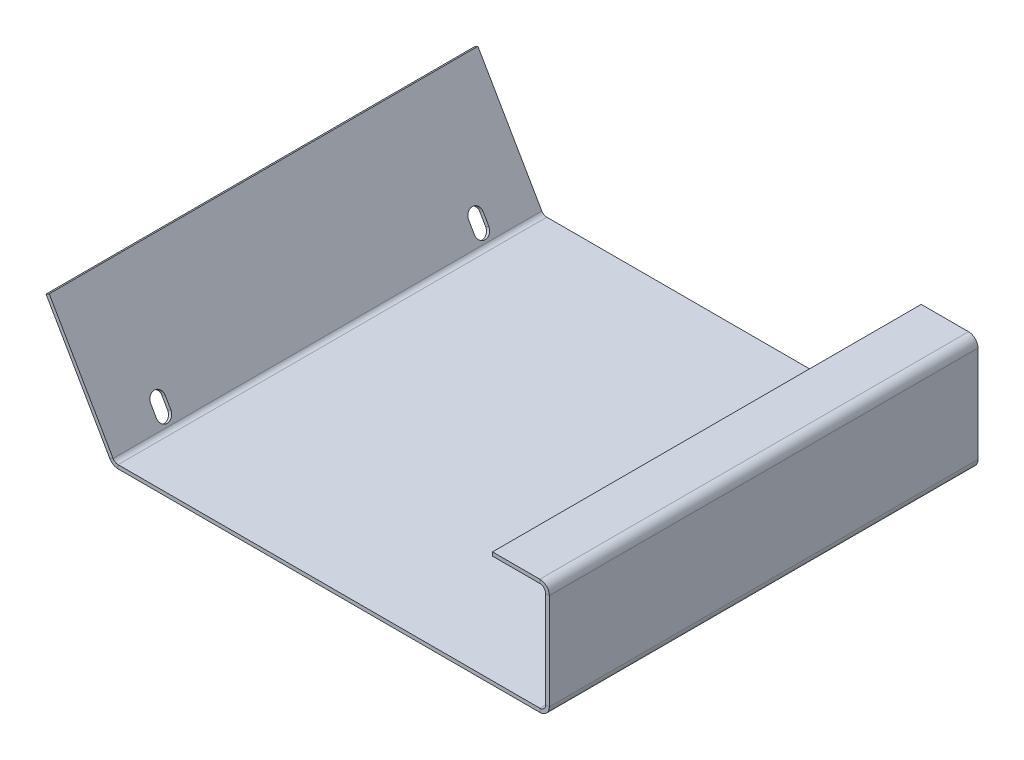
ISO-10303-21;
HEADER;
FILE_DESCRIPTION(('STEP AP214'),'2;1');
FILE_NAME('part.step','',(''),(''),'','','');
FILE_SCHEMA(('AUTOMOTIVE_DESIGN { 1 0 10303 214 1 1 1 1 }'));
ENDSEC;
DATA;
#1=APPLICATION_CONTEXT('core data for automotive mechanical design processes');
#2=APPLICATION_PROTOCOL_DEFINITION('international standard','automotive_design',2000,#1);
#3=PRODUCT_CONTEXT('',#1,'mechanical');
#4=PRODUCT('Part','Part','',(#3));
#5=PRODUCT_RELATED_PRODUCT_CATEGORY('part','',(#4));
#6=PRODUCT_DEFINITION_FORMATION('','',#4);
#7=PRODUCT_DEFINITION_CONTEXT('part definition',#1,'design');
#8=PRODUCT_DEFINITION('design','',#6,#7);
#9=PRODUCT_DEFINITION_SHAPE('','',#8);
#10=(LENGTH_UNIT() NAMED_UNIT(*) SI_UNIT(.MILLI.,.METRE.));
#11=(NAMED_UNIT(*) PLANE_ANGLE_UNIT() SI_UNIT($,.RADIAN.));
#12=(NAMED_UNIT(*) SI_UNIT($,.STERADIAN.) SOLID_ANGLE_UNIT());
#13=UNCERTAINTY_MEASURE_WITH_UNIT(LENGTH_MEASURE(1.E-05),#10,'distance_accuracy_value','');
#14=(GEOMETRIC_REPRESENTATION_CONTEXT(3) GLOBAL_UNCERTAINTY_ASSIGNED_CONTEXT((#13)) GLOBAL_UNIT_ASSIGNED_CONTEXT((#10,
#11,#12)) REPRESENTATION_CONTEXT('',''));
#15=CARTESIAN_POINT('',(0.,0.,0.));
#16=DIRECTION('',(0.,0.,1.));
#17=DIRECTION('',(1.,0.,0.));
#18=AXIS2_PLACEMENT_3D('',#15,#16,#17);
#19=CARTESIAN_POINT('',(-333.823111465835,2.08279999999999,94.375));
#20=DIRECTION('',(0.,0.,1.));
#21=DIRECTION('',(1.,0.,0.));
#22=AXIS2_PLACEMENT_3D('',#19,#20,#21);
#23=PLANE('',#22);
#24=DIRECTION('',(0.866025403784434,0.500000000000008,0.));
#25=VECTOR('',#24,1.);
#26=CARTESIAN_POINT('',(-333.823111465835,2.08279999999999,94.375));
#27=LINE('',#26,#25);
#28=CARTESIAN_POINT('',(-333.823111465835,2.08279999999999,94.375));
#29=VERTEX_POINT('',#28);
#30=CARTESIAN_POINT('',(-332.415300569443,2.8956,94.375));
#31=VERTEX_POINT('',#30);
#32=EDGE_CURVE('E11',#29,#31,#27,.T.);
#33=ORIENTED_EDGE('',*,*,#32,.F.);
#34=CARTESIAN_POINT('',(-330.21559604383,4.1656,94.375));
#35=DIRECTION('',(0.,0.,-1.));
#36=DIRECTION('',(-1.,0.,0.));
#37=AXIS2_PLACEMENT_3D('',#34,#35,#36);
#38=CIRCLE('',#37,4.1656);
#39=CARTESIAN_POINT('',(-330.21559604383,0.,94.375));
#40=VERTEX_POINT('',#39);
#41=EDGE_CURVE('E304',#40,#29,#38,.T.);
#42=ORIENTED_EDGE('',*,*,#41,.F.);
#43=DIRECTION('',(0.,-1.,0.));
#44=VECTOR('',#43,1.);
#45=CARTESIAN_POINT('',(-330.21559604383,1.6256,94.375));
#46=LINE('',#45,#44);
#47=CARTESIAN_POINT('',(-330.21559604383,1.6256,94.375));
#48=VERTEX_POINT('',#47);
#49=EDGE_CURVE('E58',#48,#40,#46,.T.);
#50=ORIENTED_EDGE('',*,*,#49,.F.);
#51=CARTESIAN_POINT('',(-330.21559604383,4.1656,94.375));
#52=DIRECTION('',(0.,0.,1.));
#53=DIRECTION('',(1.,0.,0.));
#54=AXIS2_PLACEMENT_3D('',#51,#52,#53);
#55=CIRCLE('',#54,2.54);
#56=EDGE_CURVE('E347',#48,#31,#55,.F.);
#57=ORIENTED_EDGE('',*,*,#56,.T.);
#58=EDGE_LOOP('',(#33,#42,#50,#57));
#59=FACE_BOUND('',#58,.T.);
#60=ADVANCED_FACE('F51',(#59),#23,.T.);
#61=CARTESIAN_POINT('',(-330.21559604383,1.6256,94.375));
#62=DIRECTION('',(0.,0.,1.));
#63=DIRECTION('',(1.,0.,0.));
#64=AXIS2_PLACEMENT_3D('',#61,#62,#63);
#65=PLANE('',#64);
#66=DIRECTION('',(-0.500000000000004,0.866025403784436,0.));
#67=VECTOR('',#66,1.);
#68=CARTESIAN_POINT('',(-332.620606325167,0.,94.375));
#69=LINE('',#68,#67);
#70=CARTESIAN_POINT('',(-361.95,50.8,94.375));
#71=VERTEX_POINT('',#70);
#72=EDGE_CURVE('E301',#29,#71,#69,.T.);
#73=ORIENTED_EDGE('',*,*,#72,.F.);
#74=ORIENTED_EDGE('',*,*,#32,.T.);
#75=DIRECTION('',(-0.500000000000005,0.866025403784436,0.));
#76=VECTOR('',#75,1.);
#77=CARTESIAN_POINT('',(-331.212795428775,0.812800000000007,94.375));
#78=LINE('',#77,#76);
#79=CARTESIAN_POINT('',(-360.542189103608,51.6128,94.375));
#80=VERTEX_POINT('',#79);
#81=EDGE_CURVE('E295',#31,#80,#78,.T.);
#82=ORIENTED_EDGE('',*,*,#81,.T.);
#83=DIRECTION('',(0.866025403784428,0.500000000000018,0.));
#84=VECTOR('',#83,1.);
#85=CARTESIAN_POINT('',(-361.95,50.8,94.375));
#86=LINE('',#85,#84);
#87=EDGE_CURVE('E297',#71,#80,#86,.T.);
#88=ORIENTED_EDGE('',*,*,#87,.F.);
#89=EDGE_LOOP('',(#73,#74,#82,#88));
#90=FACE_BOUND('',#89,.T.);
#91=ADVANCED_FACE('F571',(#90),#65,.T.);
#92=CARTESIAN_POINT('',(-330.21559604383,0.,-94.375));
#93=DIRECTION('',(0.,0.,-1.));
#94=DIRECTION('',(-1.,0.,0.));
#95=AXIS2_PLACEMENT_3D('',#92,#93,#94);
#96=PLANE('',#95);
#97=DIRECTION('',(0.,1.,0.));
#98=VECTOR('',#97,1.);
#99=CARTESIAN_POINT('',(-330.21559604383,0.,-94.375));
#100=LINE('',#99,#98);
#101=CARTESIAN_POINT('',(-330.21559604383,0.,-94.375));
#102=VERTEX_POINT('',#101);
#103=CARTESIAN_POINT('',(-330.21559604383,1.6256,-94.375));
#104=VERTEX_POINT('',#103);
#105=EDGE_CURVE('E487',#102,#104,#100,.T.);
#106=ORIENTED_EDGE('',*,*,#105,.F.);
#107=CARTESIAN_POINT('',(-330.21559604383,4.1656,-94.375));
#108=DIRECTION('',(0.,0.,-1.));
#109=DIRECTION('',(-1.,0.,0.));
#110=AXIS2_PLACEMENT_3D('',#107,#108,#109);
#111=CIRCLE('',#110,4.1656);
#112=CARTESIAN_POINT('',(-333.823111465835,2.08279999999999,-94.375));
#113=VERTEX_POINT('',#112);
#114=EDGE_CURVE('E361',#102,#113,#111,.T.);
#115=ORIENTED_EDGE('',*,*,#114,.T.);
#116=DIRECTION('',(-0.866025403784434,-0.500000000000008,0.));
#117=VECTOR('',#116,1.);
#118=CARTESIAN_POINT('',(-332.415300569443,2.8956,-94.375));
#119=LINE('',#118,#117);
#120=CARTESIAN_POINT('',(-332.415300569443,2.8956,-94.375));
#121=VERTEX_POINT('',#120);
#122=EDGE_CURVE('E484',#121,#113,#119,.T.);
#123=ORIENTED_EDGE('',*,*,#122,.F.);
#124=CARTESIAN_POINT('',(-330.21559604383,4.1656,-94.375));
#125=DIRECTION('',(0.,0.,1.));
#126=DIRECTION('',(1.,0.,0.));
#127=AXIS2_PLACEMENT_3D('',#124,#125,#126);
#128=CIRCLE('',#127,2.54);
#129=EDGE_CURVE('E298',#104,#121,#128,.F.);
#130=ORIENTED_EDGE('',*,*,#129,.F.);
#131=EDGE_LOOP('',(#106,#115,#123,#130));
#132=FACE_BOUND('',#131,.T.);
#133=ADVANCED_FACE('F578',(#132),#96,.T.);
#134=CARTESIAN_POINT('',(-332.415300569443,2.8956,-94.375));
#135=DIRECTION('',(0.,0.,-1.));
#136=DIRECTION('',(-1.,0.,0.));
#137=AXIS2_PLACEMENT_3D('',#134,#135,#136);
#138=PLANE('',#137);
#139=DIRECTION('',(-1.,0.,0.));
#140=VECTOR('',#139,1.);
#141=CARTESIAN_POINT('',(-332.620606325167,0.,-94.375));
#142=LINE('',#141,#140);
#143=CARTESIAN_POINT('',(-144.5156,0.,-94.375));
#144=VERTEX_POINT('',#143);
#145=EDGE_CURVE('E365',#144,#102,#142,.T.);
#146=ORIENTED_EDGE('',*,*,#145,.T.);
#147=ORIENTED_EDGE('',*,*,#105,.T.);
#148=DIRECTION('',(1.,0.,0.));
#149=VECTOR('',#148,1.);
#150=CARTESIAN_POINT('',(-332.620606325167,1.6256,-94.375));
#151=LINE('',#150,#149);
#152=CARTESIAN_POINT('',(-144.5156,1.6256,-94.375));
#153=VERTEX_POINT('',#152);
#154=EDGE_CURVE('E400',#153,#104,#151,.F.);
#155=ORIENTED_EDGE('',*,*,#154,.F.);
#156=DIRECTION('',(0.,-1.,0.));
#157=VECTOR('',#156,1.);
#158=CARTESIAN_POINT('',(-144.5156,1.6256,-94.375));
#159=LINE('',#158,#157);
#160=EDGE_CURVE('E474',#153,#144,#159,.T.);
#161=ORIENTED_EDGE('',*,*,#160,.T.);
#162=EDGE_LOOP('',(#146,#147,#155,#161));
#163=FACE_BOUND('',#162,.T.);
#164=ADVANCED_FACE('F580',(#163),#138,.T.);
#165=CARTESIAN_POINT('',(-144.5156,0.,94.375));
#166=DIRECTION('',(0.,0.,1.));
#167=DIRECTION('',(1.,0.,0.));
#168=AXIS2_PLACEMENT_3D('',#165,#166,#167);
#169=PLANE('',#168);
#170=DIRECTION('',(0.,1.,0.));
#171=VECTOR('',#170,1.);
#172=CARTESIAN_POINT('',(-144.5156,0.,94.375));
#173=LINE('',#172,#171);
#174=CARTESIAN_POINT('',(-144.5156,0.,94.375));
#175=VERTEX_POINT('',#174);
#176=CARTESIAN_POINT('',(-144.5156,1.6256,94.375));
#177=VERTEX_POINT('',#176);
#178=EDGE_CURVE('E482',#175,#177,#173,.T.);
#179=ORIENTED_EDGE('',*,*,#178,.F.);
#180=CARTESIAN_POINT('',(-144.5156,4.1656,94.375));
#181=DIRECTION('',(0.,0.,-1.));
#182=DIRECTION('',(-1.,0.,0.));
#183=AXIS2_PLACEMENT_3D('',#180,#181,#182);
#184=CIRCLE('',#183,4.1656);
#185=CARTESIAN_POINT('',(-140.35,4.1656,94.375));
#186=VERTEX_POINT('',#185);
#187=EDGE_CURVE('E310',#186,#175,#184,.T.);
#188=ORIENTED_EDGE('',*,*,#187,.F.);
#189=DIRECTION('',(1.,0.,0.));
#190=VECTOR('',#189,1.);
#191=CARTESIAN_POINT('',(-141.9756,4.1656,94.375));
#192=LINE('',#191,#190);
#193=CARTESIAN_POINT('',(-141.9756,4.1656,94.375));
#194=VERTEX_POINT('',#193);
#195=EDGE_CURVE('E480',#194,#186,#192,.T.);
#196=ORIENTED_EDGE('',*,*,#195,.F.);
#197=CARTESIAN_POINT('',(-144.5156,4.1656,94.375));
#198=DIRECTION('',(0.,0.,1.));
#199=DIRECTION('',(1.,0.,0.));
#200=AXIS2_PLACEMENT_3D('',#197,#198,#199);
#201=CIRCLE('',#200,2.54);
#202=EDGE_CURVE('E341',#194,#177,#201,.F.);
#203=ORIENTED_EDGE('',*,*,#202,.T.);
#204=EDGE_LOOP('',(#179,#188,#196,#203));
#205=FACE_BOUND('',#204,.T.);
#206=ADVANCED_FACE('F511',(#205),#169,.T.);
#207=CARTESIAN_POINT('',(-141.9756,4.1656,94.375));
#208=DIRECTION('',(0.,0.,1.));
#209=DIRECTION('',(1.,0.,0.));
#210=AXIS2_PLACEMENT_3D('',#207,#208,#209);
#211=PLANE('',#210);
#212=DIRECTION('',(-1.,0.,0.));
#213=VECTOR('',#212,1.);
#214=CARTESIAN_POINT('',(-332.620606325167,0.,94.375));
#215=LINE('',#214,#213);
#216=EDGE_CURVE('E307',#175,#40,#215,.T.);
#217=ORIENTED_EDGE('',*,*,#216,.F.);
#218=ORIENTED_EDGE('',*,*,#178,.T.);
#219=DIRECTION('',(1.,0.,0.));
#220=VECTOR('',#219,1.);
#221=CARTESIAN_POINT('',(-332.620606325167,1.6256,94.375));
#222=LINE('',#221,#220);
#223=EDGE_CURVE('E344',#177,#48,#222,.F.);
#224=ORIENTED_EDGE('',*,*,#223,.T.);
#225=ORIENTED_EDGE('',*,*,#49,.T.);
#226=EDGE_LOOP('',(#217,#218,#224,#225));
#227=FACE_BOUND('',#226,.T.);
#228=ADVANCED_FACE('F492',(#227),#211,.T.);
#229=CARTESIAN_POINT('',(-140.35,4.1656,-94.375));
#230=DIRECTION('',(0.,0.,-1.));
#231=DIRECTION('',(-1.,0.,0.));
#232=AXIS2_PLACEMENT_3D('',#229,#230,#231);
#233=PLANE('',#232);
#234=DIRECTION('',(-1.,0.,0.));
#235=VECTOR('',#234,1.);
#236=CARTESIAN_POINT('',(-140.35,4.1656,-94.375));
#237=LINE('',#236,#235);
#238=CARTESIAN_POINT('',(-140.35,4.1656,-94.375));
#239=VERTEX_POINT('',#238);
#240=CARTESIAN_POINT('',(-141.9756,4.1656,-94.375));
#241=VERTEX_POINT('',#240);
#242=EDGE_CURVE('E477',#239,#241,#237,.T.);
#243=ORIENTED_EDGE('',*,*,#242,.F.);
#244=CARTESIAN_POINT('',(-144.5156,4.1656,-94.375));
#245=DIRECTION('',(0.,0.,-1.));
#246=DIRECTION('',(-1.,0.,0.));
#247=AXIS2_PLACEMENT_3D('',#244,#245,#246);
#248=CIRCLE('',#247,4.1656);
#249=EDGE_CURVE('E369',#239,#144,#248,.T.);
#250=ORIENTED_EDGE('',*,*,#249,.T.);
#251=ORIENTED_EDGE('',*,*,#160,.F.);
#252=CARTESIAN_POINT('',(-144.5156,4.1656,-94.375));
#253=DIRECTION('',(0.,0.,1.));
#254=DIRECTION('',(1.,0.,0.));
#255=AXIS2_PLACEMENT_3D('',#252,#253,#254);
#256=CIRCLE('',#255,2.54);
#257=EDGE_CURVE('E396',#241,#153,#256,.F.);
#258=ORIENTED_EDGE('',*,*,#257,.F.);
#259=EDGE_LOOP('',(#243,#250,#251,#258));
#260=FACE_BOUND('',#259,.T.);
#261=ADVANCED_FACE('F582',(#260),#233,.T.);
#262=CARTESIAN_POINT('',(-144.5156,1.6256,-94.375));
#263=DIRECTION('',(0.,0.,-1.));
#264=DIRECTION('',(-1.,0.,0.));
#265=AXIS2_PLACEMENT_3D('',#262,#263,#264);
#266=PLANE('',#265);
#267=DIRECTION('',(0.,-1.,0.));
#268=VECTOR('',#267,1.);
#269=CARTESIAN_POINT('',(-140.35,0.,-94.375));
#270=LINE('',#269,#268);
#271=CARTESIAN_POINT('',(-140.35,46.6344,-94.375));
#272=VERTEX_POINT('',#271);
#273=EDGE_CURVE('E373',#272,#239,#270,.T.);
#274=ORIENTED_EDGE('',*,*,#273,.T.);
#275=ORIENTED_EDGE('',*,*,#242,.T.);
#276=DIRECTION('',(0.,-1.,0.));
#277=VECTOR('',#276,1.);
#278=CARTESIAN_POINT('',(-141.9756,0.,-94.375));
#279=LINE('',#278,#277);
#280=CARTESIAN_POINT('',(-141.9756,46.6344,-94.375));
#281=VERTEX_POINT('',#280);
#282=EDGE_CURVE('E392',#281,#241,#279,.T.);
#283=ORIENTED_EDGE('',*,*,#282,.F.);
#284=DIRECTION('',(1.,0.,0.));
#285=VECTOR('',#284,1.);
#286=CARTESIAN_POINT('',(-141.9756,46.6344,-94.375));
#287=LINE('',#286,#285);
#288=EDGE_CURVE('E464',#281,#272,#287,.T.);
#289=ORIENTED_EDGE('',*,*,#288,.T.);
#290=EDGE_LOOP('',(#274,#275,#283,#289));
#291=FACE_BOUND('',#290,.T.);
#292=ADVANCED_FACE('F584',(#291),#266,.T.);
#293=CARTESIAN_POINT('',(-140.35,46.6344,94.375));
#294=DIRECTION('',(0.,0.,1.));
#295=DIRECTION('',(1.,0.,0.));
#296=AXIS2_PLACEMENT_3D('',#293,#294,#295);
#297=PLANE('',#296);
#298=DIRECTION('',(-1.,0.,0.));
#299=VECTOR('',#298,1.);
#300=CARTESIAN_POINT('',(-140.35,46.6344,94.375));
#301=LINE('',#300,#299);
#302=CARTESIAN_POINT('',(-140.35,46.6344,94.375));
#303=VERTEX_POINT('',#302);
#304=CARTESIAN_POINT('',(-141.9756,46.6344,94.375));
#305=VERTEX_POINT('',#304);
#306=EDGE_CURVE('E471',#303,#305,#301,.T.);
#307=ORIENTED_EDGE('',*,*,#306,.F.);
#308=CARTESIAN_POINT('',(-144.5156,46.6344,94.375));
#309=DIRECTION('',(0.,0.,-1.));
#310=DIRECTION('',(-1.,0.,0.));
#311=AXIS2_PLACEMENT_3D('',#308,#309,#310);
#312=CIRCLE('',#311,4.1656);
#313=CARTESIAN_POINT('',(-144.5156,50.8,94.375));
#314=VERTEX_POINT('',#313);
#315=EDGE_CURVE('E317',#314,#303,#312,.T.);
#316=ORIENTED_EDGE('',*,*,#315,.F.);
#317=DIRECTION('',(0.,1.,0.));
#318=VECTOR('',#317,1.);
#319=CARTESIAN_POINT('',(-144.5156,49.1744,94.375));
#320=LINE('',#319,#318);
#321=CARTESIAN_POINT('',(-144.5156,49.1744,94.375));
#322=VERTEX_POINT('',#321);
#323=EDGE_CURVE('E468',#322,#314,#320,.T.);
#324=ORIENTED_EDGE('',*,*,#323,.F.);
#325=CARTESIAN_POINT('',(-144.5156,46.6344,94.375));
#326=DIRECTION('',(0.,0.,1.));
#327=DIRECTION('',(1.,0.,0.));
#328=AXIS2_PLACEMENT_3D('',#325,#326,#327);
#329=CIRCLE('',#328,2.54);
#330=EDGE_CURVE('E333',#322,#305,#329,.F.);
#331=ORIENTED_EDGE('',*,*,#330,.T.);
#332=EDGE_LOOP('',(#307,#316,#324,#331));
#333=FACE_BOUND('',#332,.T.);
#334=ADVANCED_FACE('F525',(#333),#297,.T.);
#335=CARTESIAN_POINT('',(-144.5156,49.1744,94.375));
#336=DIRECTION('',(0.,0.,1.));
#337=DIRECTION('',(1.,0.,0.));
#338=AXIS2_PLACEMENT_3D('',#335,#336,#337);
#339=PLANE('',#338);
#340=DIRECTION('',(0.,-1.,0.));
#341=VECTOR('',#340,1.);
#342=CARTESIAN_POINT('',(-140.35,0.,94.375));
#343=LINE('',#342,#341);
#344=EDGE_CURVE('E313',#303,#186,#343,.T.);
#345=ORIENTED_EDGE('',*,*,#344,.F.);
#346=ORIENTED_EDGE('',*,*,#306,.T.);
#347=DIRECTION('',(0.,-1.,0.));
#348=VECTOR('',#347,1.);
#349=CARTESIAN_POINT('',(-141.9756,0.,94.375));
#350=LINE('',#349,#348);
#351=EDGE_CURVE('E337',#305,#194,#350,.T.);
#352=ORIENTED_EDGE('',*,*,#351,.T.);
#353=ORIENTED_EDGE('',*,*,#195,.T.);
#354=EDGE_LOOP('',(#345,#346,#352,#353));
#355=FACE_BOUND('',#354,.T.);
#356=ADVANCED_FACE('F518',(#355),#339,.T.);
#357=CARTESIAN_POINT('',(-144.5156,50.8,-94.375));
#358=DIRECTION('',(0.,0.,-1.));
#359=DIRECTION('',(-1.,0.,0.));
#360=AXIS2_PLACEMENT_3D('',#357,#358,#359);
#361=PLANE('',#360);
#362=DIRECTION('',(0.,-1.,0.));
#363=VECTOR('',#362,1.);
#364=CARTESIAN_POINT('',(-144.5156,50.8,-94.375));
#365=LINE('',#364,#363);
#366=CARTESIAN_POINT('',(-144.5156,50.8,-94.375));
#367=VERTEX_POINT('',#366);
#368=CARTESIAN_POINT('',(-144.5156,49.1744,-94.375));
#369=VERTEX_POINT('',#368);
#370=EDGE_CURVE('E466',#367,#369,#365,.T.);
#371=ORIENTED_EDGE('',*,*,#370,.F.);
#372=CARTESIAN_POINT('',(-144.5156,46.6344,-94.375));
#373=DIRECTION('',(0.,0.,-1.));
#374=DIRECTION('',(-1.,0.,0.));
#375=AXIS2_PLACEMENT_3D('',#372,#373,#374);
#376=CIRCLE('',#375,4.1656);
#377=EDGE_CURVE('E377',#367,#272,#376,.T.);
#378=ORIENTED_EDGE('',*,*,#377,.T.);
#379=ORIENTED_EDGE('',*,*,#288,.F.);
#380=CARTESIAN_POINT('',(-144.5156,46.6344,-94.375));
#381=DIRECTION('',(0.,0.,1.));
#382=DIRECTION('',(1.,0.,0.));
#383=AXIS2_PLACEMENT_3D('',#380,#381,#382);
#384=CIRCLE('',#383,2.54);
#385=EDGE_CURVE('E389',#369,#281,#384,.F.);
#386=ORIENTED_EDGE('',*,*,#385,.F.);
#387=EDGE_LOOP('',(#371,#378,#379,#386));
#388=FACE_BOUND('',#387,.T.);
#389=ADVANCED_FACE('F586',(#388),#361,.T.);
#390=CARTESIAN_POINT('',(-141.9756,46.6344,-94.375));
#391=DIRECTION('',(0.,0.,-1.));
#392=DIRECTION('',(-1.,0.,0.));
#393=AXIS2_PLACEMENT_3D('',#390,#391,#392);
#394=PLANE('',#393);
#395=DIRECTION('',(1.,0.,0.));
#396=VECTOR('',#395,1.);
#397=CARTESIAN_POINT('',(-140.35,50.8,-94.375));
#398=LINE('',#397,#396);
#399=CARTESIAN_POINT('',(-165.35,50.8,-94.375));
#400=VERTEX_POINT('',#399);
#401=EDGE_CURVE('E380',#400,#367,#398,.T.);
#402=ORIENTED_EDGE('',*,*,#401,.T.);
#403=ORIENTED_EDGE('',*,*,#370,.T.);
#404=DIRECTION('',(1.,0.,0.));
#405=VECTOR('',#404,1.);
#406=CARTESIAN_POINT('',(-140.35,49.1744,-94.375));
#407=LINE('',#406,#405);
#408=CARTESIAN_POINT('',(-165.35,49.1744,-94.375));
#409=VERTEX_POINT('',#408);
#410=EDGE_CURVE('E386',#409,#369,#407,.T.);
#411=ORIENTED_EDGE('',*,*,#410,.F.);
#412=DIRECTION('',(0.,1.,0.));
#413=VECTOR('',#412,1.);
#414=CARTESIAN_POINT('',(-165.35,49.1744,-94.375));
#415=LINE('',#414,#413);
#416=EDGE_CURVE('E383',#409,#400,#415,.T.);
#417=ORIENTED_EDGE('',*,*,#416,.T.);
#418=EDGE_LOOP('',(#402,#403,#411,#417));
#419=FACE_BOUND('',#418,.T.);
#420=ADVANCED_FACE('F588',(#419),#394,.T.);
#421=CARTESIAN_POINT('',(-331.212795428775,0.812800000000007,94.375));
#422=DIRECTION('',(-0.866025403784436,-0.500000000000005,0.));
#423=DIRECTION('',(0.500000000000005,-0.866025403784436,0.));
#424=AXIS2_PLACEMENT_3D('',#421,#422,#423);
#425=PLANE('',#424);
#426=DIRECTION('',(-0.500000000000005,0.866025403784436,0.));
#427=VECTOR('',#426,1.);
#428=CARTESIAN_POINT('',(-334.542189103608,6.57947900320934,66.825));
#429=LINE('',#428,#427);
#430=CARTESIAN_POINT('',(-334.542189103608,6.57947900320935,66.825));
#431=VERTEX_POINT('',#430);
#432=CARTESIAN_POINT('',(-337.042189103608,10.9096060221315,66.825));
#433=VERTEX_POINT('',#432);
#434=EDGE_CURVE('E248',#431,#433,#429,.T.);
#435=ORIENTED_EDGE('',*,*,#434,.F.);
#436=CARTESIAN_POINT('',(-334.542189103608,6.57947900320934,70.));
#437=DIRECTION('',(-0.866025403784436,-0.500000000000005,0.));
#438=DIRECTION('',(0.500000000000005,-0.866025403784436,0.));
#439=AXIS2_PLACEMENT_3D('',#436,#437,#438);
#440=CIRCLE('',#439,3.175);
#441=CARTESIAN_POINT('',(-334.542189103608,6.57947900320935,73.175));
#442=VERTEX_POINT('',#441);
#443=EDGE_CURVE('E228',#442,#431,#440,.F.);
#444=ORIENTED_EDGE('',*,*,#443,.F.);
#445=DIRECTION('',(0.500000000000005,-0.866025403784436,0.));
#446=VECTOR('',#445,1.);
#447=CARTESIAN_POINT('',(-334.542189103608,6.57947900320934,73.175));
#448=LINE('',#447,#446);
#449=CARTESIAN_POINT('',(-337.042189103608,10.9096060221316,73.175));
#450=VERTEX_POINT('',#449);
#451=EDGE_CURVE('E239',#450,#442,#448,.T.);
#452=ORIENTED_EDGE('',*,*,#451,.F.);
#453=CARTESIAN_POINT('',(-337.042189103608,10.9096060221315,70.));
#454=DIRECTION('',(-0.866025403784436,-0.500000000000005,0.));
#455=DIRECTION('',(0.500000000000005,-0.866025403784436,0.));
#456=AXIS2_PLACEMENT_3D('',#453,#454,#455);
#457=CIRCLE('',#456,3.175);
#458=EDGE_CURVE('E65',#433,#450,#457,.F.);
#459=ORIENTED_EDGE('',*,*,#458,.F.);
#460=EDGE_LOOP('',(#435,#444,#452,#459));
#461=FACE_BOUND('',#460,.T.);
#462=DIRECTION('',(-0.500000000000005,0.866025403784436,0.));
#463=VECTOR('',#462,1.);
#464=CARTESIAN_POINT('',(-334.542189103608,6.57947900320934,-73.175));
#465=LINE('',#464,#463);
#466=CARTESIAN_POINT('',(-334.542189103608,6.57947900320935,-73.175));
#467=VERTEX_POINT('',#466);
#468=CARTESIAN_POINT('',(-337.042189103608,10.9096060221315,-73.175));
#469=VERTEX_POINT('',#468);
#470=EDGE_CURVE('E291',#467,#469,#465,.T.);
#471=ORIENTED_EDGE('',*,*,#470,.F.);
#472=CARTESIAN_POINT('',(-334.542189103608,6.57947900320934,-70.));
#473=DIRECTION('',(-0.866025403784436,-0.500000000000005,0.));
#474=DIRECTION('',(0.500000000000005,-0.866025403784436,0.));
#475=AXIS2_PLACEMENT_3D('',#472,#473,#474);
#476=CIRCLE('',#475,3.175);
#477=CARTESIAN_POINT('',(-334.542189103608,6.57947900320935,-66.825));
#478=VERTEX_POINT('',#477);
#479=EDGE_CURVE('E288',#478,#467,#476,.F.);
#480=ORIENTED_EDGE('',*,*,#479,.F.);
#481=DIRECTION('',(0.500000000000005,-0.866025403784436,0.));
#482=VECTOR('',#481,1.);
#483=CARTESIAN_POINT('',(-334.542189103608,6.57947900320934,-66.825));
#484=LINE('',#483,#482);
#485=CARTESIAN_POINT('',(-337.042189103608,10.9096060221316,-66.825));
#486=VERTEX_POINT('',#485);
#487=EDGE_CURVE('E265',#486,#478,#484,.T.);
#488=ORIENTED_EDGE('',*,*,#487,.F.);
#489=CARTESIAN_POINT('',(-337.042189103608,10.9096060221315,-70.));
#490=DIRECTION('',(-0.866025403784436,-0.500000000000005,0.));
#491=DIRECTION('',(0.500000000000005,-0.866025403784436,0.));
#492=AXIS2_PLACEMENT_3D('',#489,#490,#491);
#493=CIRCLE('',#492,3.175);
#494=EDGE_CURVE('E73',#469,#486,#493,.F.);
#495=ORIENTED_EDGE('',*,*,#494,.F.);
#496=EDGE_LOOP('',(#471,#480,#488,#495));
#497=FACE_BOUND('',#496,.T.);
#498=DIRECTION('',(-0.500000000000005,0.866025403784436,0.));
#499=VECTOR('',#498,1.);
#500=CARTESIAN_POINT('',(-331.212795428775,0.812800000000007,-94.375));
#501=LINE('',#500,#499);
#502=CARTESIAN_POINT('',(-360.542189103608,51.6128,-94.375));
#503=VERTEX_POINT('',#502);
#504=EDGE_CURVE('E242',#121,#503,#501,.T.);
#505=ORIENTED_EDGE('',*,*,#504,.T.);
#506=DIRECTION('',(0.,0.,-1.));
#507=VECTOR('',#506,1.);
#508=CARTESIAN_POINT('',(-360.542189103608,51.6128,94.375));
#509=LINE('',#508,#507);
#510=EDGE_CURVE('E462',#80,#503,#509,.T.);
#511=ORIENTED_EDGE('',*,*,#510,.F.);
#512=ORIENTED_EDGE('',*,*,#81,.F.);
#513=DIRECTION('',(0.,0.,-1.));
#514=VECTOR('',#513,1.);
#515=CARTESIAN_POINT('',(-332.415300569443,2.8956,94.375));
#516=LINE('',#515,#514);
#517=EDGE_CURVE('E350',#31,#121,#516,.T.);
#518=ORIENTED_EDGE('',*,*,#517,.T.);
#519=EDGE_LOOP('',(#505,#511,#512,#518));
#520=FACE_BOUND('',#519,.T.);
#521=ADVANCED_FACE('F245',(#461,#497,#520),#425,.F.);
#522=CARTESIAN_POINT('',(-361.95,50.8,94.375));
#523=DIRECTION('',(-0.500000000000018,0.866025403784429,0.));
#524=DIRECTION('',(-0.866025403784429,-0.500000000000018,0.));
#525=AXIS2_PLACEMENT_3D('',#522,#523,#524);
#526=PLANE('',#525);
#527=DIRECTION('',(0.866025403784428,0.500000000000018,0.));
#528=VECTOR('',#527,1.);
#529=CARTESIAN_POINT('',(-361.95,50.8,-94.375));
#530=LINE('',#529,#528);
#531=CARTESIAN_POINT('',(-361.95,50.8,-94.375));
#532=VERTEX_POINT('',#531);
#533=EDGE_CURVE('E354',#532,#503,#530,.T.);
#534=ORIENTED_EDGE('',*,*,#533,.F.);
#535=DIRECTION('',(0.,0.,-1.));
#536=VECTOR('',#535,1.);
#537=CARTESIAN_POINT('',(-361.95,50.8,94.375));
#538=LINE('',#537,#536);
#539=EDGE_CURVE('E460',#71,#532,#538,.T.);
#540=ORIENTED_EDGE('',*,*,#539,.F.);
#541=ORIENTED_EDGE('',*,*,#87,.T.);
#542=ORIENTED_EDGE('',*,*,#510,.T.);
#543=EDGE_LOOP('',(#534,#540,#541,#542));
#544=FACE_BOUND('',#543,.T.);
#545=ADVANCED_FACE('F596',(#544),#526,.T.);
#546=CARTESIAN_POINT('',(-332.620606325167,0.,94.375));
#547=DIRECTION('',(-0.866025403784436,-0.500000000000004,0.));
#548=DIRECTION('',(0.500000000000004,-0.866025403784436,0.));
#549=AXIS2_PLACEMENT_3D('',#546,#547,#548);
#550=PLANE('',#549);
#551=CARTESIAN_POINT('',(-335.95,5.76667900320929,70.));
#552=DIRECTION('',(-0.866025403784436,-0.500000000000004,0.));
#553=DIRECTION('',(0.500000000000004,-0.866025403784436,0.));
#554=AXIS2_PLACEMENT_3D('',#551,#552,#553);
#555=CIRCLE('',#554,3.175);
#556=CARTESIAN_POINT('',(-335.95,5.76667900320929,66.825));
#557=VERTEX_POINT('',#556);
#558=CARTESIAN_POINT('',(-335.95,5.76667900320929,73.175));
#559=VERTEX_POINT('',#558);
#560=EDGE_CURVE('E231',#557,#559,#555,.T.);
#561=ORIENTED_EDGE('',*,*,#560,.F.);
#562=DIRECTION('',(0.500000000000009,-0.866025403784433,0.));
#563=VECTOR('',#562,1.);
#564=CARTESIAN_POINT('',(-335.95,5.76667900320929,66.825));
#565=LINE('',#564,#563);
#566=CARTESIAN_POINT('',(-338.45,10.0968060221315,66.825));
#567=VERTEX_POINT('',#566);
#568=EDGE_CURVE('E236',#567,#557,#565,.T.);
#569=ORIENTED_EDGE('',*,*,#568,.F.);
#570=CARTESIAN_POINT('',(-338.45,10.0968060221315,70.));
#571=DIRECTION('',(-0.866025403784436,-0.500000000000004,0.));
#572=DIRECTION('',(0.500000000000004,-0.866025403784436,0.));
#573=AXIS2_PLACEMENT_3D('',#570,#571,#572);
#574=CIRCLE('',#573,3.175);
#575=CARTESIAN_POINT('',(-338.45,10.0968060221315,73.175));
#576=VERTEX_POINT('',#575);
#577=EDGE_CURVE('E256',#576,#567,#574,.T.);
#578=ORIENTED_EDGE('',*,*,#577,.F.);
#579=DIRECTION('',(-0.500000000000009,0.866025403784433,0.));
#580=VECTOR('',#579,1.);
#581=CARTESIAN_POINT('',(-335.95,5.76667900320929,73.175));
#582=LINE('',#581,#580);
#583=EDGE_CURVE('E250',#559,#576,#582,.T.);
#584=ORIENTED_EDGE('',*,*,#583,.F.);
#585=EDGE_LOOP('',(#561,#569,#578,#584));
#586=FACE_BOUND('',#585,.T.);
#587=CARTESIAN_POINT('',(-335.95,5.76667900320929,-70.));
#588=DIRECTION('',(-0.866025403784436,-0.500000000000004,0.));
#589=DIRECTION('',(-0.500000000000004,0.866025403784436,0.));
#590=AXIS2_PLACEMENT_3D('',#587,#588,#589);
#591=CIRCLE('',#590,3.175);
#592=CARTESIAN_POINT('',(-335.95,5.76667900320929,-73.175));
#593=VERTEX_POINT('',#592);
#594=CARTESIAN_POINT('',(-335.95,5.76667900320929,-66.825));
#595=VERTEX_POINT('',#594);
#596=EDGE_CURVE('E286',#593,#595,#591,.T.);
#597=ORIENTED_EDGE('',*,*,#596,.F.);
#598=DIRECTION('',(0.500000000000009,-0.866025403784433,0.));
#599=VECTOR('',#598,1.);
#600=CARTESIAN_POINT('',(-335.95,5.76667900320929,-73.175));
#601=LINE('',#600,#599);
#602=CARTESIAN_POINT('',(-338.45,10.0968060221315,-73.175));
#603=VERTEX_POINT('',#602);
#604=EDGE_CURVE('E272',#603,#593,#601,.T.);
#605=ORIENTED_EDGE('',*,*,#604,.F.);
#606=CARTESIAN_POINT('',(-338.45,10.0968060221315,-70.));
#607=DIRECTION('',(-0.866025403784436,-0.500000000000004,0.));
#608=DIRECTION('',(-0.500000000000004,0.866025403784436,0.));
#609=AXIS2_PLACEMENT_3D('',#606,#607,#608);
#610=CIRCLE('',#609,3.175);
#611=CARTESIAN_POINT('',(-338.45,10.0968060221315,-66.825));
#612=VERTEX_POINT('',#611);
#613=EDGE_CURVE('E280',#612,#603,#610,.T.);
#614=ORIENTED_EDGE('',*,*,#613,.F.);
#615=DIRECTION('',(-0.500000000000009,0.866025403784433,0.));
#616=VECTOR('',#615,1.);
#617=CARTESIAN_POINT('',(-335.95,5.76667900320929,-66.825));
#618=LINE('',#617,#616);
#619=EDGE_CURVE('E283',#595,#612,#618,.T.);
#620=ORIENTED_EDGE('',*,*,#619,.F.);
#621=EDGE_LOOP('',(#597,#605,#614,#620));
#622=FACE_BOUND('',#621,.T.);
#623=DIRECTION('',(-0.500000000000004,0.866025403784436,0.));
#624=VECTOR('',#623,1.);
#625=CARTESIAN_POINT('',(-332.620606325167,0.,-94.375));
#626=LINE('',#625,#624);
#627=EDGE_CURVE('E357',#113,#532,#626,.T.);
#628=ORIENTED_EDGE('',*,*,#627,.F.);
#629=DIRECTION('',(0.,0.,-1.));
#630=VECTOR('',#629,1.);
#631=CARTESIAN_POINT('',(-333.823111465835,2.08279999999999,94.375));
#632=LINE('',#631,#630);
#633=EDGE_CURVE('E456',#29,#113,#632,.T.);
#634=ORIENTED_EDGE('',*,*,#633,.F.);
#635=ORIENTED_EDGE('',*,*,#72,.T.);
#636=ORIENTED_EDGE('',*,*,#539,.T.);
#637=EDGE_LOOP('',(#628,#634,#635,#636));
#638=FACE_BOUND('',#637,.T.);
#639=ADVANCED_FACE('F574',(#586,#622,#638),#550,.T.);
#640=CARTESIAN_POINT('',(-330.21559604383,4.1656,94.375));
#641=DIRECTION('',(0.,0.,-1.));
#642=DIRECTION('',(-1.,0.,0.));
#643=AXIS2_PLACEMENT_3D('',#640,#641,#642);
#644=CYLINDRICAL_SURFACE('',#643,4.1656);
#645=ORIENTED_EDGE('',*,*,#114,.F.);
#646=DIRECTION('',(0.,0.,-1.));
#647=VECTOR('',#646,1.);
#648=CARTESIAN_POINT('',(-330.21559604383,0.,94.375));
#649=LINE('',#648,#647);
#650=EDGE_CURVE('E452',#40,#102,#649,.T.);
#651=ORIENTED_EDGE('',*,*,#650,.F.);
#652=ORIENTED_EDGE('',*,*,#41,.T.);
#653=ORIENTED_EDGE('',*,*,#633,.T.);
#654=EDGE_LOOP('',(#645,#651,#652,#653));
#655=FACE_BOUND('',#654,.T.);
#656=ADVANCED_FACE('F499',(#655),#644,.T.);
#657=CARTESIAN_POINT('',(-332.620606325167,0.,94.375));
#658=DIRECTION('',(0.,-1.,0.));
#659=DIRECTION('',(0.,0.,-1.));
#660=AXIS2_PLACEMENT_3D('',#657,#658,#659);
#661=PLANE('',#660);
#662=ORIENTED_EDGE('',*,*,#145,.F.);
#663=DIRECTION('',(0.,0.,-1.));
#664=VECTOR('',#663,1.);
#665=CARTESIAN_POINT('',(-144.5156,0.,94.375));
#666=LINE('',#665,#664);
#667=EDGE_CURVE('E448',#175,#144,#666,.T.);
#668=ORIENTED_EDGE('',*,*,#667,.F.);
#669=ORIENTED_EDGE('',*,*,#216,.T.);
#670=ORIENTED_EDGE('',*,*,#650,.T.);
#671=EDGE_LOOP('',(#662,#668,#669,#670));
#672=FACE_BOUND('',#671,.T.);
#673=ADVANCED_FACE('F504',(#672),#661,.T.);
#674=CARTESIAN_POINT('',(-144.5156,4.1656,94.375));
#675=DIRECTION('',(0.,0.,-1.));
#676=DIRECTION('',(-1.,0.,0.));
#677=AXIS2_PLACEMENT_3D('',#674,#675,#676);
#678=CYLINDRICAL_SURFACE('',#677,4.1656);
#679=ORIENTED_EDGE('',*,*,#249,.F.);
#680=DIRECTION('',(0.,0.,-1.));
#681=VECTOR('',#680,1.);
#682=CARTESIAN_POINT('',(-140.35,4.1656,94.375));
#683=LINE('',#682,#681);
#684=EDGE_CURVE('E444',#186,#239,#683,.T.);
#685=ORIENTED_EDGE('',*,*,#684,.F.);
#686=ORIENTED_EDGE('',*,*,#187,.T.);
#687=ORIENTED_EDGE('',*,*,#667,.T.);
#688=EDGE_LOOP('',(#679,#685,#686,#687));
#689=FACE_BOUND('',#688,.T.);
#690=ADVANCED_FACE('F507',(#689),#678,.T.);
#691=CARTESIAN_POINT('',(-140.35,0.,94.375));
#692=DIRECTION('',(1.,0.,0.));
#693=DIRECTION('',(0.,1.,0.));
#694=AXIS2_PLACEMENT_3D('',#691,#692,#693);
#695=PLANE('',#694);
#696=ORIENTED_EDGE('',*,*,#273,.F.);
#697=DIRECTION('',(0.,0.,-1.));
#698=VECTOR('',#697,1.);
#699=CARTESIAN_POINT('',(-140.35,46.6344,94.375));
#700=LINE('',#699,#698);
#701=EDGE_CURVE('E440',#303,#272,#700,.T.);
#702=ORIENTED_EDGE('',*,*,#701,.F.);
#703=ORIENTED_EDGE('',*,*,#344,.T.);
#704=ORIENTED_EDGE('',*,*,#684,.T.);
#705=EDGE_LOOP('',(#696,#702,#703,#704));
#706=FACE_BOUND('',#705,.T.);
#707=ADVANCED_FACE('F516',(#706),#695,.T.);
#708=CARTESIAN_POINT('',(-144.5156,46.6344,94.375));
#709=DIRECTION('',(0.,0.,-1.));
#710=DIRECTION('',(-1.,0.,0.));
#711=AXIS2_PLACEMENT_3D('',#708,#709,#710);
#712=CYLINDRICAL_SURFACE('',#711,4.1656);
#713=ORIENTED_EDGE('',*,*,#377,.F.);
#714=DIRECTION('',(0.,0.,-1.));
#715=VECTOR('',#714,1.);
#716=CARTESIAN_POINT('',(-144.5156,50.8,94.375));
#717=LINE('',#716,#715);
#718=EDGE_CURVE('E436',#314,#367,#717,.T.);
#719=ORIENTED_EDGE('',*,*,#718,.F.);
#720=ORIENTED_EDGE('',*,*,#315,.T.);
#721=ORIENTED_EDGE('',*,*,#701,.T.);
#722=EDGE_LOOP('',(#713,#719,#720,#721));
#723=FACE_BOUND('',#722,.T.);
#724=ADVANCED_FACE('F523',(#723),#712,.T.);
#725=CARTESIAN_POINT('',(-140.35,50.8,94.375));
#726=DIRECTION('',(0.,1.,0.));
#727=DIRECTION('',(0.,0.,1.));
#728=AXIS2_PLACEMENT_3D('',#725,#726,#727);
#729=PLANE('',#728);
#730=ORIENTED_EDGE('',*,*,#401,.F.);
#731=DIRECTION('',(0.,0.,-1.));
#732=VECTOR('',#731,1.);
#733=CARTESIAN_POINT('',(-165.35,50.8,94.375));
#734=LINE('',#733,#732);
#735=CARTESIAN_POINT('',(-165.35,50.8,94.375));
#736=VERTEX_POINT('',#735);
#737=EDGE_CURVE('E433',#736,#400,#734,.T.);
#738=ORIENTED_EDGE('',*,*,#737,.F.);
#739=DIRECTION('',(1.,0.,0.));
#740=VECTOR('',#739,1.);
#741=CARTESIAN_POINT('',(-140.35,50.8,94.375));
#742=LINE('',#741,#740);
#743=EDGE_CURVE('E321',#736,#314,#742,.T.);
#744=ORIENTED_EDGE('',*,*,#743,.T.);
#745=ORIENTED_EDGE('',*,*,#718,.T.);
#746=EDGE_LOOP('',(#730,#738,#744,#745));
#747=FACE_BOUND('',#746,.T.);
#748=ADVANCED_FACE('F529',(#747),#729,.T.);
#749=CARTESIAN_POINT('',(-165.35,49.1744,94.375));
#750=DIRECTION('',(-1.,0.,0.));
#751=DIRECTION('',(0.,0.,1.));
#752=AXIS2_PLACEMENT_3D('',#749,#750,#751);
#753=PLANE('',#752);
#754=ORIENTED_EDGE('',*,*,#416,.F.);
#755=DIRECTION('',(0.,0.,-1.));
#756=VECTOR('',#755,1.);
#757=CARTESIAN_POINT('',(-165.35,49.1744,94.375));
#758=LINE('',#757,#756);
#759=CARTESIAN_POINT('',(-165.35,49.1744,94.375));
#760=VERTEX_POINT('',#759);
#761=EDGE_CURVE('E430',#760,#409,#758,.T.);
#762=ORIENTED_EDGE('',*,*,#761,.F.);
#763=DIRECTION('',(0.,1.,0.));
#764=VECTOR('',#763,1.);
#765=CARTESIAN_POINT('',(-165.35,49.1744,94.375));
#766=LINE('',#765,#764);
#767=EDGE_CURVE('E325',#760,#736,#766,.T.);
#768=ORIENTED_EDGE('',*,*,#767,.T.);
#769=ORIENTED_EDGE('',*,*,#737,.T.);
#770=EDGE_LOOP('',(#754,#762,#768,#769));
#771=FACE_BOUND('',#770,.T.);
#772=ADVANCED_FACE('F535',(#771),#753,.T.);
#773=CARTESIAN_POINT('',(-140.35,49.1744,94.375));
#774=DIRECTION('',(0.,1.,0.));
#775=DIRECTION('',(0.,0.,1.));
#776=AXIS2_PLACEMENT_3D('',#773,#774,#775);
#777=PLANE('',#776);
#778=ORIENTED_EDGE('',*,*,#410,.T.);
#779=DIRECTION('',(0.,0.,-1.));
#780=VECTOR('',#779,1.);
#781=CARTESIAN_POINT('',(-144.5156,49.1744,94.375));
#782=LINE('',#781,#780);
#783=EDGE_CURVE('E426',#322,#369,#782,.T.);
#784=ORIENTED_EDGE('',*,*,#783,.F.);
#785=DIRECTION('',(1.,0.,0.));
#786=VECTOR('',#785,1.);
#787=CARTESIAN_POINT('',(-140.35,49.1744,94.375));
#788=LINE('',#787,#786);
#789=EDGE_CURVE('E329',#760,#322,#788,.T.);
#790=ORIENTED_EDGE('',*,*,#789,.F.);
#791=ORIENTED_EDGE('',*,*,#761,.T.);
#792=EDGE_LOOP('',(#778,#784,#790,#791));
#793=FACE_BOUND('',#792,.T.);
#794=ADVANCED_FACE('F540',(#793),#777,.F.);
#795=CARTESIAN_POINT('',(-144.5156,46.6344,94.375));
#796=DIRECTION('',(0.,0.,-1.));
#797=DIRECTION('',(-1.,0.,0.));
#798=AXIS2_PLACEMENT_3D('',#795,#796,#797);
#799=CYLINDRICAL_SURFACE('',#798,2.54);
#800=ORIENTED_EDGE('',*,*,#385,.T.);
#801=DIRECTION('',(0.,0.,-1.));
#802=VECTOR('',#801,1.);
#803=CARTESIAN_POINT('',(-141.9756,46.6344,94.375));
#804=LINE('',#803,#802);
#805=EDGE_CURVE('E422',#305,#281,#804,.T.);
#806=ORIENTED_EDGE('',*,*,#805,.F.);
#807=ORIENTED_EDGE('',*,*,#330,.F.);
#808=ORIENTED_EDGE('',*,*,#783,.T.);
#809=EDGE_LOOP('',(#800,#806,#807,#808));
#810=FACE_BOUND('',#809,.T.);
#811=ADVANCED_FACE('F545',(#810),#799,.F.);
#812=CARTESIAN_POINT('',(-141.9756,0.,94.375));
#813=DIRECTION('',(1.,0.,0.));
#814=DIRECTION('',(0.,1.,0.));
#815=AXIS2_PLACEMENT_3D('',#812,#813,#814);
#816=PLANE('',#815);
#817=ORIENTED_EDGE('',*,*,#282,.T.);
#818=DIRECTION('',(0.,0.,-1.));
#819=VECTOR('',#818,1.);
#820=CARTESIAN_POINT('',(-141.9756,4.1656,94.375));
#821=LINE('',#820,#819);
#822=EDGE_CURVE('E418',#194,#241,#821,.T.);
#823=ORIENTED_EDGE('',*,*,#822,.F.);
#824=ORIENTED_EDGE('',*,*,#351,.F.);
#825=ORIENTED_EDGE('',*,*,#805,.T.);
#826=EDGE_LOOP('',(#817,#823,#824,#825));
#827=FACE_BOUND('',#826,.T.);
#828=ADVANCED_FACE('F550',(#827),#816,.F.);
#829=CARTESIAN_POINT('',(-144.5156,4.1656,94.375));
#830=DIRECTION('',(0.,0.,-1.));
#831=DIRECTION('',(-1.,0.,0.));
#832=AXIS2_PLACEMENT_3D('',#829,#830,#831);
#833=CYLINDRICAL_SURFACE('',#832,2.54);
#834=ORIENTED_EDGE('',*,*,#257,.T.);
#835=DIRECTION('',(0.,0.,-1.));
#836=VECTOR('',#835,1.);
#837=CARTESIAN_POINT('',(-144.5156,1.6256,94.375));
#838=LINE('',#837,#836);
#839=EDGE_CURVE('E414',#177,#153,#838,.T.);
#840=ORIENTED_EDGE('',*,*,#839,.F.);
#841=ORIENTED_EDGE('',*,*,#202,.F.);
#842=ORIENTED_EDGE('',*,*,#822,.T.);
#843=EDGE_LOOP('',(#834,#840,#841,#842));
#844=FACE_BOUND('',#843,.T.);
#845=ADVANCED_FACE('F555',(#844),#833,.F.);
#846=CARTESIAN_POINT('',(-332.620606325167,1.6256,94.375));
#847=DIRECTION('',(0.,-1.,0.));
#848=DIRECTION('',(0.,0.,-1.));
#849=AXIS2_PLACEMENT_3D('',#846,#847,#848);
#850=PLANE('',#849);
#851=ORIENTED_EDGE('',*,*,#154,.T.);
#852=DIRECTION('',(0.,0.,-1.));
#853=VECTOR('',#852,1.);
#854=CARTESIAN_POINT('',(-330.21559604383,1.6256,94.375));
#855=LINE('',#854,#853);
#856=EDGE_CURVE('E410',#48,#104,#855,.T.);
#857=ORIENTED_EDGE('',*,*,#856,.F.);
#858=ORIENTED_EDGE('',*,*,#223,.F.);
#859=ORIENTED_EDGE('',*,*,#839,.T.);
#860=EDGE_LOOP('',(#851,#857,#858,#859));
#861=FACE_BOUND('',#860,.T.);
#862=ADVANCED_FACE('F558',(#861),#850,.F.);
#863=CARTESIAN_POINT('',(-330.21559604383,4.1656,94.375));
#864=DIRECTION('',(0.,0.,-1.));
#865=DIRECTION('',(-1.,0.,0.));
#866=AXIS2_PLACEMENT_3D('',#863,#864,#865);
#867=CYLINDRICAL_SURFACE('',#866,2.54);
#868=ORIENTED_EDGE('',*,*,#129,.T.);
#869=ORIENTED_EDGE('',*,*,#517,.F.);
#870=ORIENTED_EDGE('',*,*,#56,.F.);
#871=ORIENTED_EDGE('',*,*,#856,.T.);
#872=EDGE_LOOP('',(#868,#869,#870,#871));
#873=FACE_BOUND('',#872,.T.);
#874=ADVANCED_FACE('F563',(#873),#867,.F.);
#875=CARTESIAN_POINT('',(-330.21559604383,4.1656,94.375));
#876=DIRECTION('',(0.,0.,-1.));
#877=DIRECTION('',(-1.,0.,0.));
#878=AXIS2_PLACEMENT_3D('',#875,#876,#877);
#879=PLANE('',#878);
#880=ORIENTED_EDGE('',*,*,#789,.T.);
#881=ORIENTED_EDGE('',*,*,#323,.T.);
#882=ORIENTED_EDGE('',*,*,#743,.F.);
#883=ORIENTED_EDGE('',*,*,#767,.F.);
#884=EDGE_LOOP('',(#880,#881,#882,#883));
#885=FACE_BOUND('',#884,.T.);
#886=ADVANCED_FACE('F532',(#885),#879,.F.);
#887=CARTESIAN_POINT('',(-330.21559604383,4.1656,-94.375));
#888=DIRECTION('',(0.,0.,-1.));
#889=DIRECTION('',(-1.,0.,0.));
#890=AXIS2_PLACEMENT_3D('',#887,#888,#889);
#891=PLANE('',#890);
#892=ORIENTED_EDGE('',*,*,#504,.F.);
#893=ORIENTED_EDGE('',*,*,#122,.T.);
#894=ORIENTED_EDGE('',*,*,#627,.T.);
#895=ORIENTED_EDGE('',*,*,#533,.T.);
#896=EDGE_LOOP('',(#892,#893,#894,#895));
#897=FACE_BOUND('',#896,.T.);
#898=ADVANCED_FACE('F797',(#897),#891,.T.);
#899=CARTESIAN_POINT('',(-169.396864263201,101.926176755228,-70.));
#900=DIRECTION('',(-0.866025403784436,-0.500000000000004,0.));
#901=DIRECTION('',(0.500000000000005,-0.866025403784436,0.));
#902=AXIS2_PLACEMENT_3D('',#899,#900,#901);
#903=CYLINDRICAL_SURFACE('',#902,3.175);
#904=ORIENTED_EDGE('',*,*,#479,.T.);
#905=DIRECTION('',(-0.866025403784436,-0.500000000000004,0.));
#906=VECTOR('',#905,1.);
#907=CARTESIAN_POINT('',(-169.396864263201,101.926176755228,-73.175));
#908=LINE('',#907,#906);
#909=EDGE_CURVE('E268',#467,#593,#908,.T.);
#910=ORIENTED_EDGE('',*,*,#909,.T.);
#911=ORIENTED_EDGE('',*,*,#596,.T.);
#912=DIRECTION('',(-0.866025403784436,-0.500000000000004,0.));
#913=VECTOR('',#912,1.);
#914=CARTESIAN_POINT('',(-169.396864263201,101.926176755228,-66.825));
#915=LINE('',#914,#913);
#916=EDGE_CURVE('E269',#478,#595,#915,.T.);
#917=ORIENTED_EDGE('',*,*,#916,.F.);
#918=EDGE_LOOP('',(#904,#910,#911,#917));
#919=FACE_BOUND('',#918,.T.);
#920=ADVANCED_FACE('F806',(#919),#903,.F.);
#921=CARTESIAN_POINT('',(-169.396864263201,101.926176755228,-73.175));
#922=DIRECTION('',(0.,0.,-1.));
#923=DIRECTION('',(-1.,0.,0.));
#924=AXIS2_PLACEMENT_3D('',#921,#922,#923);
#925=PLANE('',#924);
#926=ORIENTED_EDGE('',*,*,#470,.T.);
#927=DIRECTION('',(-0.866025403784436,-0.500000000000004,0.));
#928=VECTOR('',#927,1.);
#929=CARTESIAN_POINT('',(-171.896864263201,106.25630377415,-73.175));
#930=LINE('',#929,#928);
#931=EDGE_CURVE('E275',#469,#603,#930,.T.);
#932=ORIENTED_EDGE('',*,*,#931,.T.);
#933=ORIENTED_EDGE('',*,*,#604,.T.);
#934=ORIENTED_EDGE('',*,*,#909,.F.);
#935=EDGE_LOOP('',(#926,#932,#933,#934));
#936=FACE_BOUND('',#935,.T.);
#937=ADVANCED_FACE('F815',(#936),#925,.F.);
#938=CARTESIAN_POINT('',(-171.896864263201,106.25630377415,-70.));
#939=DIRECTION('',(-0.866025403784436,-0.500000000000004,0.));
#940=DIRECTION('',(0.500000000000005,-0.866025403784436,0.));
#941=AXIS2_PLACEMENT_3D('',#938,#939,#940);
#942=CYLINDRICAL_SURFACE('',#941,3.175);
#943=ORIENTED_EDGE('',*,*,#494,.T.);
#944=DIRECTION('',(-0.866025403784436,-0.500000000000004,0.));
#945=VECTOR('',#944,1.);
#946=CARTESIAN_POINT('',(-171.896864263201,106.25630377415,-66.825));
#947=LINE('',#946,#945);
#948=EDGE_CURVE('E273',#486,#612,#947,.T.);
#949=ORIENTED_EDGE('',*,*,#948,.T.);
#950=ORIENTED_EDGE('',*,*,#613,.T.);
#951=ORIENTED_EDGE('',*,*,#931,.F.);
#952=EDGE_LOOP('',(#943,#949,#950,#951));
#953=FACE_BOUND('',#952,.T.);
#954=ADVANCED_FACE('F826',(#953),#942,.F.);
#955=CARTESIAN_POINT('',(-169.396864263201,101.926176755228,-66.825));
#956=DIRECTION('',(0.,0.,1.));
#957=DIRECTION('',(1.,0.,0.));
#958=AXIS2_PLACEMENT_3D('',#955,#956,#957);
#959=PLANE('',#958);
#960=ORIENTED_EDGE('',*,*,#487,.T.);
#961=ORIENTED_EDGE('',*,*,#916,.T.);
#962=ORIENTED_EDGE('',*,*,#619,.T.);
#963=ORIENTED_EDGE('',*,*,#948,.F.);
#964=EDGE_LOOP('',(#960,#961,#962,#963));
#965=FACE_BOUND('',#964,.T.);
#966=ADVANCED_FACE('F837',(#965),#959,.F.);
#967=CARTESIAN_POINT('',(-169.396864263201,101.926176755228,70.));
#968=DIRECTION('',(-0.866025403784436,-0.500000000000004,0.));
#969=DIRECTION('',(0.500000000000005,-0.866025403784436,0.));
#970=AXIS2_PLACEMENT_3D('',#967,#968,#969);
#971=CYLINDRICAL_SURFACE('',#970,3.175);
#972=ORIENTED_EDGE('',*,*,#443,.T.);
#973=DIRECTION('',(-0.866025403784436,-0.500000000000004,0.));
#974=VECTOR('',#973,1.);
#975=CARTESIAN_POINT('',(-169.396864263201,101.926176755228,66.825));
#976=LINE('',#975,#974);
#977=EDGE_CURVE('E243',#431,#557,#976,.T.);
#978=ORIENTED_EDGE('',*,*,#977,.T.);
#979=ORIENTED_EDGE('',*,*,#560,.T.);
#980=DIRECTION('',(-0.866025403784436,-0.500000000000004,0.));
#981=VECTOR('',#980,1.);
#982=CARTESIAN_POINT('',(-169.396864263201,101.926176755228,73.175));
#983=LINE('',#982,#981);
#984=EDGE_CURVE('E224',#442,#559,#983,.T.);
#985=ORIENTED_EDGE('',*,*,#984,.F.);
#986=EDGE_LOOP('',(#972,#978,#979,#985));
#987=FACE_BOUND('',#986,.T.);
#988=ADVANCED_FACE('F226',(#987),#971,.F.);
#989=CARTESIAN_POINT('',(-169.396864263201,101.926176755228,66.825));
#990=DIRECTION('',(0.,0.,-1.));
#991=DIRECTION('',(-1.,0.,0.));
#992=AXIS2_PLACEMENT_3D('',#989,#990,#991);
#993=PLANE('',#992);
#994=ORIENTED_EDGE('',*,*,#434,.T.);
#995=DIRECTION('',(-0.866025403784436,-0.500000000000004,0.));
#996=VECTOR('',#995,1.);
#997=CARTESIAN_POINT('',(-171.896864263201,106.25630377415,66.825));
#998=LINE('',#997,#996);
#999=EDGE_CURVE('E262',#433,#567,#998,.T.);
#1000=ORIENTED_EDGE('',*,*,#999,.T.);
#1001=ORIENTED_EDGE('',*,*,#568,.T.);
#1002=ORIENTED_EDGE('',*,*,#977,.F.);
#1003=EDGE_LOOP('',(#994,#1000,#1001,#1002));
#1004=FACE_BOUND('',#1003,.T.);
#1005=ADVANCED_FACE('F857',(#1004),#993,.F.);
#1006=CARTESIAN_POINT('',(-171.896864263201,106.25630377415,70.));
#1007=DIRECTION('',(-0.866025403784436,-0.500000000000004,0.));
#1008=DIRECTION('',(0.500000000000005,-0.866025403784436,0.));
#1009=AXIS2_PLACEMENT_3D('',#1006,#1007,#1008);
#1010=CYLINDRICAL_SURFACE('',#1009,3.175);
#1011=ORIENTED_EDGE('',*,*,#458,.T.);
#1012=DIRECTION('',(-0.866025403784436,-0.500000000000004,0.));
#1013=VECTOR('',#1012,1.);
#1014=CARTESIAN_POINT('',(-171.896864263201,106.25630377415,73.175));
#1015=LINE('',#1014,#1013);
#1016=EDGE_CURVE('E235',#450,#576,#1015,.T.);
#1017=ORIENTED_EDGE('',*,*,#1016,.T.);
#1018=ORIENTED_EDGE('',*,*,#577,.T.);
#1019=ORIENTED_EDGE('',*,*,#999,.F.);
#1020=EDGE_LOOP('',(#1011,#1017,#1018,#1019));
#1021=FACE_BOUND('',#1020,.T.);
#1022=ADVANCED_FACE('F867',(#1021),#1010,.F.);
#1023=CARTESIAN_POINT('',(-169.396864263201,101.926176755228,73.175));
#1024=DIRECTION('',(0.,0.,1.));
#1025=DIRECTION('',(1.,0.,0.));
#1026=AXIS2_PLACEMENT_3D('',#1023,#1024,#1025);
#1027=PLANE('',#1026);
#1028=ORIENTED_EDGE('',*,*,#451,.T.);
#1029=ORIENTED_EDGE('',*,*,#984,.T.);
#1030=ORIENTED_EDGE('',*,*,#583,.T.);
#1031=ORIENTED_EDGE('',*,*,#1016,.F.);
#1032=EDGE_LOOP('',(#1028,#1029,#1030,#1031));
#1033=FACE_BOUND('',#1032,.T.);
#1034=ADVANCED_FACE('F240',(#1033),#1027,.F.);
#1035=CLOSED_SHELL('',(#60,#91,#133,#164,#206,#228,#261,#292,#334,#356,#389,#420,#521,#545,#639,
#656,#673,#690,#707,#724,#748,#772,#794,#811,#828,#845,#862,#874,#886,#898,#920,#937,#954,#966,
#988,#1005,#1022,#1034));
#1036=MANIFOLD_SOLID_BREP('B2',#1035);
#1037=ADVANCED_BREP_SHAPE_REPRESENTATION('',(#18,#1036),#14);
#1038=SHAPE_DEFINITION_REPRESENTATION(#9,#1037);
ENDSEC;
END-ISO-10303-21;
